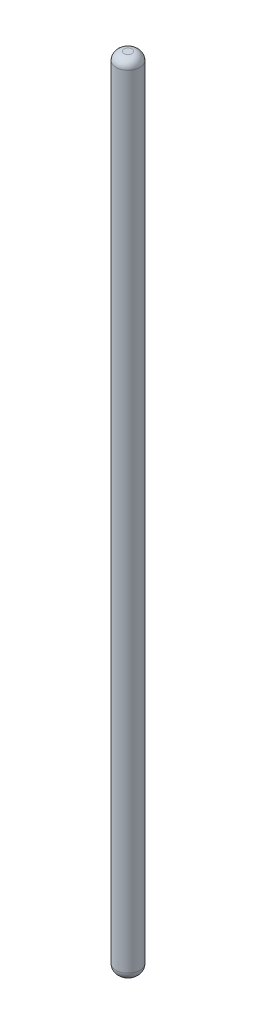
ISO-10303-21;
HEADER;
FILE_DESCRIPTION(('STEP AP214'),'2;1');
FILE_NAME('part.step','',(''),(''),'','','');
FILE_SCHEMA(('AUTOMOTIVE_DESIGN { 1 0 10303 214 1 1 1 1 }'));
ENDSEC;
DATA;
#1=APPLICATION_CONTEXT('core data for automotive mechanical design processes');
#2=APPLICATION_PROTOCOL_DEFINITION('international standard','automotive_design',2000,#1);
#3=PRODUCT_CONTEXT('',#1,'mechanical');
#4=PRODUCT('Part','Part','',(#3));
#5=PRODUCT_RELATED_PRODUCT_CATEGORY('part','',(#4));
#6=PRODUCT_DEFINITION_FORMATION('','',#4);
#7=PRODUCT_DEFINITION_CONTEXT('part definition',#1,'design');
#8=PRODUCT_DEFINITION('design','',#6,#7);
#9=PRODUCT_DEFINITION_SHAPE('','',#8);
#10=(LENGTH_UNIT() NAMED_UNIT(*) SI_UNIT(.MILLI.,.METRE.));
#11=(NAMED_UNIT(*) PLANE_ANGLE_UNIT() SI_UNIT($,.RADIAN.));
#12=(NAMED_UNIT(*) SI_UNIT($,.STERADIAN.) SOLID_ANGLE_UNIT());
#13=UNCERTAINTY_MEASURE_WITH_UNIT(LENGTH_MEASURE(1.E-05),#10,'distance_accuracy_value','');
#14=(GEOMETRIC_REPRESENTATION_CONTEXT(3) GLOBAL_UNCERTAINTY_ASSIGNED_CONTEXT((#13)) GLOBAL_UNIT_ASSIGNED_CONTEXT((#10,
#11,#12)) REPRESENTATION_CONTEXT('',''));
#15=CARTESIAN_POINT('',(0.,0.,0.));
#16=DIRECTION('',(0.,0.,1.));
#17=DIRECTION('',(1.,0.,0.));
#18=AXIS2_PLACEMENT_3D('',#15,#16,#17);
#19=CARTESIAN_POINT('',(0.,100.,0.));
#20=DIRECTION('',(0.,-1.,0.));
#21=DIRECTION('',(0.,0.,-1.));
#22=AXIS2_PLACEMENT_3D('',#19,#20,#21);
#23=CYLINDRICAL_SURFACE('',#22,1.5);
#24=CARTESIAN_POINT('',(0.,1.,0.));
#25=DIRECTION('',(0.,1.,0.));
#26=DIRECTION('',(0.,0.,1.));
#27=AXIS2_PLACEMENT_3D('',#24,#25,#26);
#28=CIRCLE('',#27,1.5);
#29=CARTESIAN_POINT('',(0.,1.,1.5));
#30=VERTEX_POINT('',#29);
#31=EDGE_CURVE('E50',#30,#30,#28,.T.);
#32=ORIENTED_EDGE('',*,*,#31,.T.);
#33=EDGE_LOOP('',(#32));
#34=FACE_BOUND('',#33,.T.);
#35=CARTESIAN_POINT('',(0.,99.,0.));
#36=DIRECTION('',(0.,1.,0.));
#37=DIRECTION('',(0.,0.,1.));
#38=AXIS2_PLACEMENT_3D('',#35,#36,#37);
#39=CIRCLE('',#38,1.5);
#40=CARTESIAN_POINT('',(0.,99.,1.5));
#41=VERTEX_POINT('',#40);
#42=EDGE_CURVE('E55',#41,#41,#39,.F.);
#43=ORIENTED_EDGE('',*,*,#42,.T.);
#44=EDGE_LOOP('',(#43));
#45=FACE_BOUND('',#44,.T.);
#46=ADVANCED_FACE('F37',(#34,#45),#23,.T.);
#47=CARTESIAN_POINT('',(0.,100.,0.));
#48=DIRECTION('',(0.,1.,0.));
#49=DIRECTION('',(0.,0.,1.));
#50=AXIS2_PLACEMENT_3D('',#47,#48,#49);
#51=PLANE('',#50);
#52=CARTESIAN_POINT('',(0.,100.,0.));
#53=DIRECTION('',(0.,1.,0.));
#54=DIRECTION('',(0.,0.,1.));
#55=AXIS2_PLACEMENT_3D('',#52,#53,#54);
#56=CIRCLE('',#55,0.5);
#57=CARTESIAN_POINT('',(0.,100.,0.5));
#58=VERTEX_POINT('',#57);
#59=EDGE_CURVE('E10',#58,#58,#56,.T.);
#60=ORIENTED_EDGE('',*,*,#59,.T.);
#61=EDGE_LOOP('',(#60));
#62=FACE_BOUND('',#61,.T.);
#63=ADVANCED_FACE('F72',(#62),#51,.T.);
#64=CARTESIAN_POINT('',(0.,0.,0.));
#65=DIRECTION('',(0.,1.,0.));
#66=DIRECTION('',(0.,0.,1.));
#67=AXIS2_PLACEMENT_3D('',#64,#65,#66);
#68=PLANE('',#67);
#69=CARTESIAN_POINT('',(0.,0.,0.));
#70=DIRECTION('',(0.,1.,0.));
#71=DIRECTION('',(0.,0.,1.));
#72=AXIS2_PLACEMENT_3D('',#69,#70,#71);
#73=CIRCLE('',#72,0.5);
#74=CARTESIAN_POINT('',(0.,0.,0.5));
#75=VERTEX_POINT('',#74);
#76=EDGE_CURVE('E45',#75,#75,#73,.F.);
#77=ORIENTED_EDGE('',*,*,#76,.T.);
#78=EDGE_LOOP('',(#77));
#79=FACE_BOUND('',#78,.T.);
#80=ADVANCED_FACE('F69',(#79),#68,.F.);
#81=CARTESIAN_POINT('',(0.,1.,0.));
#82=DIRECTION('',(0.,1.,0.));
#83=DIRECTION('',(0.,0.,1.));
#84=AXIS2_PLACEMENT_3D('',#81,#82,#83);
#85=DEGENERATE_TOROIDAL_SURFACE('',#84,0.5,1.,.T.);
#86=ORIENTED_EDGE('',*,*,#76,.F.);
#87=EDGE_LOOP('',(#86));
#88=FACE_BOUND('',#87,.T.);
#89=ORIENTED_EDGE('',*,*,#31,.F.);
#90=EDGE_LOOP('',(#89));
#91=FACE_BOUND('',#90,.T.);
#92=ADVANCED_FACE('F65',(#88,#91),#85,.T.);
#93=CARTESIAN_POINT('',(0.,99.,0.));
#94=DIRECTION('',(0.,1.,0.));
#95=DIRECTION('',(0.,0.,1.));
#96=AXIS2_PLACEMENT_3D('',#93,#94,#95);
#97=DEGENERATE_TOROIDAL_SURFACE('',#96,0.5,1.,.T.);
#98=ORIENTED_EDGE('',*,*,#42,.F.);
#99=EDGE_LOOP('',(#98));
#100=FACE_BOUND('',#99,.T.);
#101=ORIENTED_EDGE('',*,*,#59,.F.);
#102=EDGE_LOOP('',(#101));
#103=FACE_BOUND('',#102,.T.);
#104=ADVANCED_FACE('F39',(#100,#103),#97,.T.);
#105=CLOSED_SHELL('',(#46,#63,#80,#92,#104));
#106=MANIFOLD_SOLID_BREP('B2',#105);
#107=ADVANCED_BREP_SHAPE_REPRESENTATION('',(#18,#106),#14);
#108=SHAPE_DEFINITION_REPRESENTATION(#9,#107);
ENDSEC;
END-ISO-10303-21;
